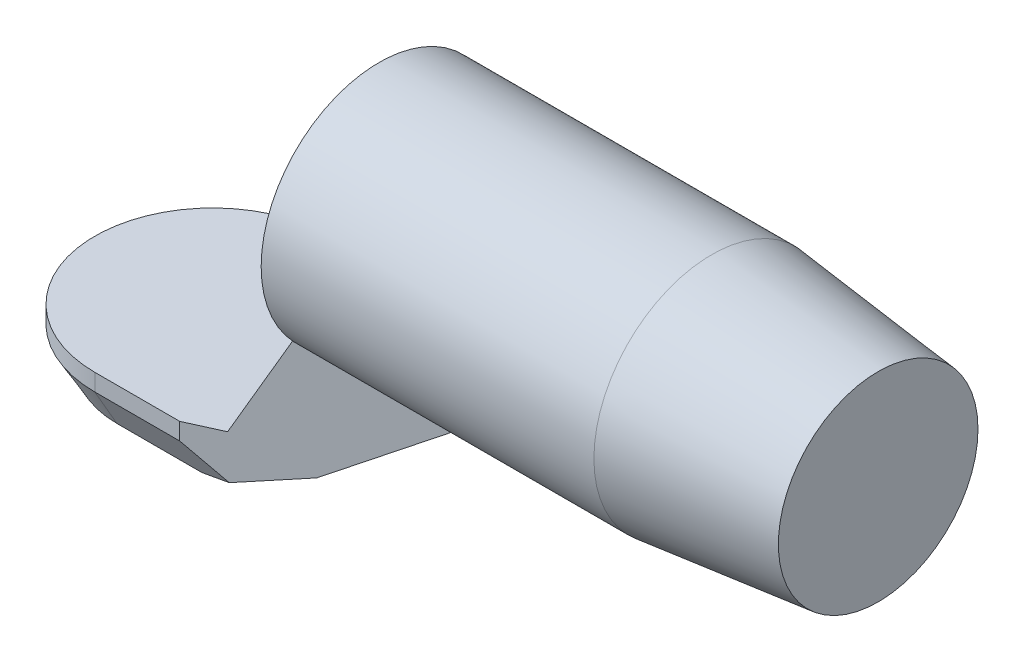
ISO-10303-21;
HEADER;
FILE_DESCRIPTION(('STEP AP214'),'2;1');
FILE_NAME('part.step','',(''),(''),'','','');
FILE_SCHEMA(('AUTOMOTIVE_DESIGN { 1 0 10303 214 1 1 1 1 }'));
ENDSEC;
DATA;
#1=APPLICATION_CONTEXT('core data for automotive mechanical design processes');
#2=APPLICATION_PROTOCOL_DEFINITION('international standard','automotive_design',2000,#1);
#3=PRODUCT_CONTEXT('',#1,'mechanical');
#4=PRODUCT('Part','Part','',(#3));
#5=PRODUCT_RELATED_PRODUCT_CATEGORY('part','',(#4));
#6=PRODUCT_DEFINITION_FORMATION('','',#4);
#7=PRODUCT_DEFINITION_CONTEXT('part definition',#1,'design');
#8=PRODUCT_DEFINITION('design','',#6,#7);
#9=PRODUCT_DEFINITION_SHAPE('','',#8);
#10=(LENGTH_UNIT() NAMED_UNIT(*) SI_UNIT(.MILLI.,.METRE.));
#11=(NAMED_UNIT(*) PLANE_ANGLE_UNIT() SI_UNIT($,.RADIAN.));
#12=(NAMED_UNIT(*) SI_UNIT($,.STERADIAN.) SOLID_ANGLE_UNIT());
#13=UNCERTAINTY_MEASURE_WITH_UNIT(LENGTH_MEASURE(1.E-05),#10,'distance_accuracy_value','');
#14=(GEOMETRIC_REPRESENTATION_CONTEXT(3) GLOBAL_UNCERTAINTY_ASSIGNED_CONTEXT((#13)) GLOBAL_UNIT_ASSIGNED_CONTEXT((#10,
#11,#12)) REPRESENTATION_CONTEXT('',''));
#15=CARTESIAN_POINT('',(0.,0.,0.));
#16=DIRECTION('',(0.,0.,1.));
#17=DIRECTION('',(1.,0.,0.));
#18=AXIS2_PLACEMENT_3D('',#15,#16,#17);
#19=CARTESIAN_POINT('',(0.,-40.,-27.));
#20=DIRECTION('',(0.,-1.,0.));
#21=DIRECTION('',(1.,0.,0.));
#22=AXIS2_PLACEMENT_3D('',#19,#20,#21);
#23=PLANE('',#22);
#24=CARTESIAN_POINT('',(-152.4,-40.,0.));
#25=DIRECTION('',(0.,1.,0.));
#26=DIRECTION('',(-1.,0.,0.));
#27=AXIS2_PLACEMENT_3D('',#24,#25,#26);
#28=CIRCLE('',#27,27.);
#29=CARTESIAN_POINT('',(-152.4,-40.,-27.));
#30=VERTEX_POINT('',#29);
#31=CARTESIAN_POINT('',(-152.4,-40.,27.));
#32=VERTEX_POINT('',#31);
#33=EDGE_CURVE('E143',#30,#32,#28,.T.);
#34=ORIENTED_EDGE('',*,*,#33,.T.);
#35=DIRECTION('',(1.,0.,0.));
#36=VECTOR('',#35,1.);
#37=CARTESIAN_POINT('',(0.,-40.,27.));
#38=LINE('',#37,#36);
#39=CARTESIAN_POINT('',(-132.943113445151,-40.,27.));
#40=VERTEX_POINT('',#39);
#41=EDGE_CURVE('E151',#32,#40,#38,.T.);
#42=ORIENTED_EDGE('',*,*,#41,.T.);
#43=DIRECTION('',(-0.910900783502955,0.,0.412625450758558));
#44=VECTOR('',#43,1.);
#45=CARTESIAN_POINT('',(-2.33837723127965,-40.,-32.162138322254));
#46=LINE('',#45,#44);
#47=CARTESIAN_POINT('',(-125.4,-40.,23.5830739836898));
#48=VERTEX_POINT('',#47);
#49=EDGE_CURVE('E223',#48,#40,#46,.T.);
#50=ORIENTED_EDGE('',*,*,#49,.F.);
#51=DIRECTION('',(0.,0.,1.));
#52=VECTOR('',#51,1.);
#53=CARTESIAN_POINT('',(-125.4,-40.,-27.));
#54=LINE('',#53,#52);
#55=CARTESIAN_POINT('',(-125.4,-40.,-23.5830739836898));
#56=VERTEX_POINT('',#55);
#57=EDGE_CURVE('E173',#56,#48,#54,.T.);
#58=ORIENTED_EDGE('',*,*,#57,.F.);
#59=DIRECTION('',(0.910900783502955,0.,0.412625450758558));
#60=VECTOR('',#59,1.);
#61=CARTESIAN_POINT('',(-22.6348629362981,-40.,22.9681111411141));
#62=LINE('',#61,#60);
#63=CARTESIAN_POINT('',(-132.943113445151,-40.,-27.));
#64=VERTEX_POINT('',#63);
#65=EDGE_CURVE('E234',#64,#56,#62,.T.);
#66=ORIENTED_EDGE('',*,*,#65,.F.);
#67=DIRECTION('',(1.,0.,0.));
#68=VECTOR('',#67,1.);
#69=CARTESIAN_POINT('',(0.,-40.,-27.));
#70=LINE('',#69,#68);
#71=EDGE_CURVE('E155',#30,#64,#70,.T.);
#72=ORIENTED_EDGE('',*,*,#71,.F.);
#73=EDGE_LOOP('',(#34,#42,#50,#58,#66,#72));
#74=FACE_BOUND('',#73,.T.);
#75=ADVANCED_FACE('F52',(#74),#23,.F.);
#76=CARTESIAN_POINT('',(0.,-52.7,-27.));
#77=DIRECTION('',(0.,1.,0.));
#78=DIRECTION('',(-1.,0.,0.));
#79=AXIS2_PLACEMENT_3D('',#76,#77,#78);
#80=PLANE('',#79);
#81=CARTESIAN_POINT('',(-152.4,-52.7,0.));
#82=DIRECTION('',(0.,1.,0.));
#83=DIRECTION('',(-1.,0.,0.));
#84=AXIS2_PLACEMENT_3D('',#81,#82,#83);
#85=CIRCLE('',#84,21.92);
#86=CARTESIAN_POINT('',(-152.4,-52.7,21.92));
#87=VERTEX_POINT('',#86);
#88=CARTESIAN_POINT('',(-152.4,-52.7,-21.92));
#89=VERTEX_POINT('',#88);
#90=EDGE_CURVE('E186',#87,#89,#85,.F.);
#91=ORIENTED_EDGE('',*,*,#90,.T.);
#92=DIRECTION('',(1.,0.,0.));
#93=VECTOR('',#92,1.);
#94=CARTESIAN_POINT('',(0.,-52.7,-21.92));
#95=LINE('',#94,#93);
#96=CARTESIAN_POINT('',(-132.943113445151,-52.7,-21.92));
#97=VERTEX_POINT('',#96);
#98=EDGE_CURVE('E190',#89,#97,#95,.T.);
#99=ORIENTED_EDGE('',*,*,#98,.T.);
#100=DIRECTION('',(0.,0.,1.));
#101=VECTOR('',#100,1.);
#102=CARTESIAN_POINT('',(-132.943113445151,-52.7,-27.));
#103=LINE('',#102,#101);
#104=CARTESIAN_POINT('',(-132.943113445151,-52.7,21.92));
#105=VERTEX_POINT('',#104);
#106=EDGE_CURVE('E170',#97,#105,#103,.T.);
#107=ORIENTED_EDGE('',*,*,#106,.T.);
#108=DIRECTION('',(-1.,0.,0.));
#109=VECTOR('',#108,1.);
#110=CARTESIAN_POINT('',(-152.4,-52.7,21.92));
#111=LINE('',#110,#109);
#112=EDGE_CURVE('E188',#105,#87,#111,.T.);
#113=ORIENTED_EDGE('',*,*,#112,.T.);
#114=EDGE_LOOP('',(#91,#99,#107,#113));
#115=FACE_BOUND('',#114,.T.);
#116=ADVANCED_FACE('F281',(#115),#80,.F.);
#117=CARTESIAN_POINT('',(-15.2923724101665,21.8653548185988,-27.));
#118=DIRECTION('',(-0.573125851127504,0.819467362845754,0.));
#119=DIRECTION('',(-0.819467362845754,-0.573125851127504,0.));
#120=AXIS2_PLACEMENT_3D('',#117,#118,#119);
#121=PLANE('',#120);
#122=DIRECTION('',(0.768244866604196,0.537301438727026,-0.348004294338689));
#123=VECTOR('',#122,1.);
#124=CARTESIAN_POINT('',(-15.1036637113754,21.9973354666556,-26.3796401805181));
#125=LINE('',#124,#123);
#126=CARTESIAN_POINT('',(-111.349334982476,-45.3157568730211,17.21831715033));
#127=VERTEX_POINT('',#126);
#128=CARTESIAN_POINT('',(-86.2505271874306,-27.7619454193626,5.84890451231851));
#129=VERTEX_POINT('',#128);
#130=EDGE_CURVE('E222',#127,#129,#125,.T.);
#131=ORIENTED_EDGE('',*,*,#130,.F.);
#132=DIRECTION('',(0.,0.,1.));
#133=VECTOR('',#132,1.);
#134=CARTESIAN_POINT('',(-111.349334982476,-45.3157568730211,-27.));
#135=LINE('',#134,#133);
#136=CARTESIAN_POINT('',(-111.349334982476,-45.3157568730211,-17.21831715033));
#137=VERTEX_POINT('',#136);
#138=EDGE_CURVE('E167',#137,#127,#135,.T.);
#139=ORIENTED_EDGE('',*,*,#138,.F.);
#140=DIRECTION('',(-0.768244866604196,-0.537301438727026,-0.348004294338689));
#141=VECTOR('',#140,1.);
#142=CARTESIAN_POINT('',(-29.5406993961987,11.9002422329622,19.839862781097));
#143=LINE('',#142,#141);
#144=CARTESIAN_POINT('',(-86.2505271874307,-27.7619454193626,-5.84890451231851));
#145=VERTEX_POINT('',#144);
#146=EDGE_CURVE('E163',#145,#137,#143,.T.);
#147=ORIENTED_EDGE('',*,*,#146,.F.);
#148=CARTESIAN_POINT('',(-88.9,-29.6149555935198,0.));
#149=DIRECTION('',(-0.573125851127504,0.819467362845754,0.));
#150=DIRECTION('',(-0.819467362845754,-0.573125851127504,0.));
#151=AXIS2_PLACEMENT_3D('',#148,#149,#150);
#152=ELLIPSE('',#151,7.83559163865379,6.42101161646386);
#153=EDGE_CURVE('E159',#129,#145,#152,.T.);
#154=ORIENTED_EDGE('',*,*,#153,.F.);
#155=EDGE_LOOP('',(#131,#139,#147,#154));
#156=FACE_BOUND('',#155,.T.);
#157=ADVANCED_FACE('F248',(#156),#121,.F.);
#158=CARTESIAN_POINT('',(2.21615707072963,-6.48071901221457,-27.));
#159=DIRECTION('',(0.323565987584047,-0.946205607507565,0.));
#160=DIRECTION('',(0.946205607507565,0.323565987584047,0.));
#161=AXIS2_PLACEMENT_3D('',#158,#159,#160);
#162=PLANE('',#161);
#163=ORIENTED_EDGE('',*,*,#106,.F.);
#164=DIRECTION('',(-0.930115062146568,-0.318063638877605,0.183634127525418));
#165=VECTOR('',#164,1.);
#166=CARTESIAN_POINT('',(-1.47394688663402,-7.74259288167652,-47.8761711018318));
#167=LINE('',#166,#165);
#168=CARTESIAN_POINT('',(-125.132748938957,-50.0291552229382,-23.4620129510003));
#169=VERTEX_POINT('',#168);
#170=EDGE_CURVE('E194',#97,#169,#167,.F.);
#171=ORIENTED_EDGE('',*,*,#170,.T.);
#172=DIRECTION('',(0.869685501181482,0.297399049260087,0.393955498164337));
#173=VECTOR('',#172,1.);
#174=CARTESIAN_POINT('',(-18.7606880242568,-13.6539946150043,24.7230587691653));
#175=LINE('',#174,#173);
#176=EDGE_CURVE('E236',#169,#137,#175,.T.);
#177=ORIENTED_EDGE('',*,*,#176,.T.);
#178=ORIENTED_EDGE('',*,*,#138,.T.);
#179=DIRECTION('',(-0.869685501181482,-0.297399049260087,0.393955498164337));
#180=VECTOR('',#179,1.);
#181=CARTESIAN_POINT('',(-0.259349241587179,-7.32724712234197,-33.1039092339965));
#182=LINE('',#181,#180);
#183=CARTESIAN_POINT('',(-125.132748938957,-50.0291552229382,23.4620129510003));
#184=VERTEX_POINT('',#183);
#185=EDGE_CURVE('E216',#127,#184,#182,.T.);
#186=ORIENTED_EDGE('',*,*,#185,.T.);
#187=DIRECTION('',(-0.930115062146568,-0.318063638877605,-0.183634127525418));
#188=VECTOR('',#187,1.);
#189=CARTESIAN_POINT('',(-10.6971937551529,-10.8965891781104,46.0552104910626));
#190=LINE('',#189,#188);
#191=EDGE_CURVE('E192',#184,#105,#190,.T.);
#192=ORIENTED_EDGE('',*,*,#191,.T.);
#193=EDGE_LOOP('',(#163,#171,#177,#178,#186,#192));
#194=FACE_BOUND('',#193,.T.);
#195=ADVANCED_FACE('F220',(#194),#162,.T.);
#196=CARTESIAN_POINT('',(-85.0294109128488,41.90870220159,-27.));
#197=DIRECTION('',(0.896969645389856,-0.44209213434441,0.));
#198=DIRECTION('',(0.44209213434441,0.896969645389856,0.));
#199=AXIS2_PLACEMENT_3D('',#196,#197,#198);
#200=PLANE('',#199);
#201=DIRECTION('',(-0.433485180824015,-0.879506823848088,0.196362788762585));
#202=VECTOR('',#201,1.);
#203=CARTESIAN_POINT('',(-82.2803845905745,47.4862571361837,4.05048485095459));
#204=LINE('',#203,#202);
#205=CARTESIAN_POINT('',(-101.191412815094,9.11729066348439,12.6169189640556));
#206=VERTEX_POINT('',#205);
#207=EDGE_CURVE('E227',#206,#48,#204,.T.);
#208=ORIENTED_EDGE('',*,*,#207,.F.);
#209=DIRECTION('',(0.,0.,1.));
#210=VECTOR('',#209,1.);
#211=CARTESIAN_POINT('',(-101.191412815094,9.11729066348439,-27.));
#212=LINE('',#211,#210);
#213=CARTESIAN_POINT('',(-101.191412815094,9.11729066348439,-12.6169189640556));
#214=VERTEX_POINT('',#213);
#215=EDGE_CURVE('E161',#214,#206,#212,.T.);
#216=ORIENTED_EDGE('',*,*,#215,.F.);
#217=DIRECTION('',(0.433485180824015,0.879506823848088,0.196362788762585));
#218=VECTOR('',#217,1.);
#219=CARTESIAN_POINT('',(-86.8768839762428,38.1603268521909,-6.13263547072805));
#220=LINE('',#219,#218);
#221=EDGE_CURVE('E232',#56,#214,#220,.T.);
#222=ORIENTED_EDGE('',*,*,#221,.F.);
#223=ORIENTED_EDGE('',*,*,#57,.T.);
#224=EDGE_LOOP('',(#208,#216,#222,#223));
#225=FACE_BOUND('',#224,.T.);
#226=ADVANCED_FACE('F265',(#225),#200,.F.);
#227=CARTESIAN_POINT('',(-47.3353532011235,-46.1372800578655,-27.));
#228=DIRECTION('',(-0.716111208331091,-0.697986201369758,0.));
#229=DIRECTION('',(0.697986201369758,-0.716111208331091,0.));
#230=AXIS2_PLACEMENT_3D('',#227,#228,#229);
#231=PLANE('',#230);
#232=DIRECTION('',(-0.66551323401047,0.682794996852812,0.301468286275181));
#233=VECTOR('',#232,1.);
#234=CARTESIAN_POINT('',(-44.281572957342,-49.270359560097,-13.1624510279191));
#235=LINE('',#234,#233);
#236=CARTESIAN_POINT('',(-86.2505271874306,-6.21157348793553,5.8489045123185));
#237=VERTEX_POINT('',#236);
#238=EDGE_CURVE('E256',#237,#206,#235,.T.);
#239=ORIENTED_EDGE('',*,*,#238,.F.);
#240=CARTESIAN_POINT('',(-88.9,-3.49330029925923,0.));
#241=DIRECTION('',(-0.716111208331091,-0.697986201369758,0.));
#242=DIRECTION('',(0.697986201369758,-0.716111208331091,0.));
#243=AXIS2_PLACEMENT_3D('',#240,#241,#242);
#244=ELLIPSE('',#243,9.19933890363877,6.42101161646386);
#245=CARTESIAN_POINT('',(-86.2505271874307,-6.21157348793544,-5.84890451231851));
#246=VERTEX_POINT('',#245);
#247=EDGE_CURVE('E181',#246,#237,#244,.T.);
#248=ORIENTED_EDGE('',*,*,#247,.F.);
#249=DIRECTION('',(0.66551323401047,-0.682794996852812,0.301468286275181));
#250=VECTOR('',#249,1.);
#251=CARTESIAN_POINT('',(-55.1156542014738,-38.1549435308588,8.25476213591554));
#252=LINE('',#251,#250);
#253=EDGE_CURVE('E225',#214,#246,#252,.T.);
#254=ORIENTED_EDGE('',*,*,#253,.F.);
#255=ORIENTED_EDGE('',*,*,#215,.T.);
#256=EDGE_LOOP('',(#239,#248,#254,#255));
#257=FACE_BOUND('',#256,.T.);
#258=ADVANCED_FACE('F268',(#257),#231,.F.);
#259=CARTESIAN_POINT('',(0.,0.,-27.));
#260=DIRECTION('',(0.,0.,1.));
#261=DIRECTION('',(1.,0.,0.));
#262=AXIS2_PLACEMENT_3D('',#259,#260,#261);
#263=PLANE('',#262);
#264=DIRECTION('',(0.,1.,0.));
#265=VECTOR('',#264,1.);
#266=CARTESIAN_POINT('',(-132.943113445151,0.,-27.));
#267=LINE('',#266,#265);
#268=CARTESIAN_POINT('',(-132.943113445151,-43.9011818975501,-27.));
#269=VERTEX_POINT('',#268);
#270=EDGE_CURVE('E179',#269,#64,#267,.T.);
#271=ORIENTED_EDGE('',*,*,#270,.F.);
#272=DIRECTION('',(-1.,0.,0.));
#273=VECTOR('',#272,1.);
#274=CARTESIAN_POINT('',(0.,-43.9011818975502,-27.));
#275=LINE('',#274,#273);
#276=CARTESIAN_POINT('',(-152.4,-43.9011818975501,-27.));
#277=VERTEX_POINT('',#276);
#278=EDGE_CURVE('E183',#269,#277,#275,.T.);
#279=ORIENTED_EDGE('',*,*,#278,.T.);
#280=DIRECTION('',(0.,1.,0.));
#281=VECTOR('',#280,1.);
#282=CARTESIAN_POINT('',(-152.4,-52.7,-27.));
#283=LINE('',#282,#281);
#284=EDGE_CURVE('E146',#277,#30,#283,.T.);
#285=ORIENTED_EDGE('',*,*,#284,.T.);
#286=ORIENTED_EDGE('',*,*,#71,.T.);
#287=EDGE_LOOP('',(#271,#279,#285,#286));
#288=FACE_BOUND('',#287,.T.);
#289=ADVANCED_FACE('F270',(#288),#263,.F.);
#290=CARTESIAN_POINT('',(0.,0.,27.));
#291=DIRECTION('',(0.,0.,1.));
#292=DIRECTION('',(1.,0.,0.));
#293=AXIS2_PLACEMENT_3D('',#290,#291,#292);
#294=PLANE('',#293);
#295=DIRECTION('',(0.,1.,0.));
#296=VECTOR('',#295,1.);
#297=CARTESIAN_POINT('',(-152.4,-52.7,27.));
#298=LINE('',#297,#296);
#299=CARTESIAN_POINT('',(-152.4,-43.9011818975501,27.));
#300=VERTEX_POINT('',#299);
#301=EDGE_CURVE('E140',#300,#32,#298,.T.);
#302=ORIENTED_EDGE('',*,*,#301,.F.);
#303=DIRECTION('',(1.,0.,0.));
#304=VECTOR('',#303,1.);
#305=CARTESIAN_POINT('',(-132.943113445151,-43.9011818975501,27.));
#306=LINE('',#305,#304);
#307=CARTESIAN_POINT('',(-132.943113445151,-43.9011818975501,27.));
#308=VERTEX_POINT('',#307);
#309=EDGE_CURVE('E69',#300,#308,#306,.T.);
#310=ORIENTED_EDGE('',*,*,#309,.T.);
#311=DIRECTION('',(0.,1.,0.));
#312=VECTOR('',#311,1.);
#313=CARTESIAN_POINT('',(-132.943113445151,0.,27.));
#314=LINE('',#313,#312);
#315=EDGE_CURVE('E158',#308,#40,#314,.T.);
#316=ORIENTED_EDGE('',*,*,#315,.T.);
#317=ORIENTED_EDGE('',*,*,#41,.F.);
#318=EDGE_LOOP('',(#302,#310,#316,#317));
#319=FACE_BOUND('',#318,.T.);
#320=ADVANCED_FACE('F157',(#319),#294,.T.);
#321=CARTESIAN_POINT('',(-88.9,27.0001,0.));
#322=DIRECTION('',(0.,-1.,0.));
#323=DIRECTION('',(1.,0.,0.));
#324=AXIS2_PLACEMENT_3D('',#321,#322,#323);
#325=CYLINDRICAL_SURFACE('',#324,6.42101161646386);
#326=ORIENTED_EDGE('',*,*,#153,.T.);
#327=DIRECTION('',(0.,-1.,0.));
#328=VECTOR('',#327,1.);
#329=CARTESIAN_POINT('',(-86.2505271874306,27.0001,-5.8489045123185));
#330=LINE('',#329,#328);
#331=EDGE_CURVE('E245',#246,#145,#330,.T.);
#332=ORIENTED_EDGE('',*,*,#331,.F.);
#333=ORIENTED_EDGE('',*,*,#247,.T.);
#334=DIRECTION('',(0.,-1.,0.));
#335=VECTOR('',#334,1.);
#336=CARTESIAN_POINT('',(-86.2505271874306,27.0001,5.84890451231851));
#337=LINE('',#336,#335);
#338=EDGE_CURVE('E251',#237,#129,#337,.T.);
#339=ORIENTED_EDGE('',*,*,#338,.T.);
#340=EDGE_LOOP('',(#326,#332,#333,#339));
#341=FACE_BOUND('',#340,.T.);
#342=ADVANCED_FACE('F254',(#341),#325,.T.);
#343=CARTESIAN_POINT('',(-86.2505271874306,27.0001,-5.8489045123185));
#344=DIRECTION('',(0.412625450758558,0.,-0.910900783502955));
#345=DIRECTION('',(-0.910900783502955,0.,-0.412625450758558));
#346=AXIS2_PLACEMENT_3D('',#343,#344,#345);
#347=PLANE('',#346);
#348=ORIENTED_EDGE('',*,*,#176,.F.);
#349=DIRECTION('',(0.741089336946627,-0.581455024914229,0.335703215155891));
#350=VECTOR('',#349,1.);
#351=CARTESIAN_POINT('',(-132.588900964885,-44.179095255995,-26.8395466476904));
#352=LINE('',#351,#350);
#353=EDGE_CURVE('E196',#169,#269,#352,.F.);
#354=ORIENTED_EDGE('',*,*,#353,.T.);
#355=ORIENTED_EDGE('',*,*,#270,.T.);
#356=ORIENTED_EDGE('',*,*,#65,.T.);
#357=ORIENTED_EDGE('',*,*,#221,.T.);
#358=ORIENTED_EDGE('',*,*,#253,.T.);
#359=ORIENTED_EDGE('',*,*,#331,.T.);
#360=ORIENTED_EDGE('',*,*,#146,.T.);
#361=EDGE_LOOP('',(#348,#354,#355,#356,#357,#358,#359,#360));
#362=FACE_BOUND('',#361,.T.);
#363=ADVANCED_FACE('F242',(#362),#347,.T.);
#364=CARTESIAN_POINT('',(-132.943113445151,27.0001,27.));
#365=DIRECTION('',(0.412625450758558,0.,0.910900783502955));
#366=DIRECTION('',(0.910900783502955,0.,-0.412625450758558));
#367=AXIS2_PLACEMENT_3D('',#364,#365,#366);
#368=PLANE('',#367);
#369=ORIENTED_EDGE('',*,*,#315,.F.);
#370=DIRECTION('',(0.741089336946627,-0.581455024914229,-0.335703215155892));
#371=VECTOR('',#370,1.);
#372=CARTESIAN_POINT('',(-163.495193256225,-19.930171329618,40.839669404143));
#373=LINE('',#372,#371);
#374=EDGE_CURVE('E61',#308,#184,#373,.T.);
#375=ORIENTED_EDGE('',*,*,#374,.T.);
#376=ORIENTED_EDGE('',*,*,#185,.F.);
#377=ORIENTED_EDGE('',*,*,#130,.T.);
#378=ORIENTED_EDGE('',*,*,#338,.F.);
#379=ORIENTED_EDGE('',*,*,#238,.T.);
#380=ORIENTED_EDGE('',*,*,#207,.T.);
#381=ORIENTED_EDGE('',*,*,#49,.T.);
#382=EDGE_LOOP('',(#369,#375,#376,#377,#378,#379,#380,#381));
#383=FACE_BOUND('',#382,.T.);
#384=ADVANCED_FACE('F215',(#383),#368,.T.);
#385=CARTESIAN_POINT('',(-152.4,-52.7,0.));
#386=DIRECTION('',(0.,1.,0.));
#387=DIRECTION('',(-1.,0.,0.));
#388=AXIS2_PLACEMENT_3D('',#385,#386,#387);
#389=CYLINDRICAL_SURFACE('',#388,27.);
#390=ORIENTED_EDGE('',*,*,#284,.F.);
#391=CARTESIAN_POINT('',(-152.4,-43.9011818975501,0.));
#392=DIRECTION('',(0.,1.,0.));
#393=DIRECTION('',(0.,0.,1.));
#394=AXIS2_PLACEMENT_3D('',#391,#392,#393);
#395=CIRCLE('',#394,27.);
#396=EDGE_CURVE('E13',#277,#300,#395,.T.);
#397=ORIENTED_EDGE('',*,*,#396,.T.);
#398=ORIENTED_EDGE('',*,*,#301,.T.);
#399=ORIENTED_EDGE('',*,*,#33,.F.);
#400=EDGE_LOOP('',(#390,#397,#398,#399));
#401=FACE_BOUND('',#400,.T.);
#402=ADVANCED_FACE('F142',(#401),#389,.T.);
#403=CARTESIAN_POINT('',(0.,-52.7,21.92));
#404=DIRECTION('',(0.,-0.500000000000001,0.866025403784438));
#405=DIRECTION('',(1.,0.,0.));
#406=AXIS2_PLACEMENT_3D('',#403,#404,#405);
#407=PLANE('',#406);
#408=ORIENTED_EDGE('',*,*,#374,.F.);
#409=ORIENTED_EDGE('',*,*,#309,.F.);
#410=DIRECTION('',(0.,0.866025403784438,0.500000000000001));
#411=VECTOR('',#410,1.);
#412=CARTESIAN_POINT('',(-152.4,-52.7,21.92));
#413=LINE('',#412,#411);
#414=EDGE_CURVE('E56',#87,#300,#413,.T.);
#415=ORIENTED_EDGE('',*,*,#414,.F.);
#416=ORIENTED_EDGE('',*,*,#112,.F.);
#417=ORIENTED_EDGE('',*,*,#191,.F.);
#418=EDGE_LOOP('',(#408,#409,#415,#416,#417));
#419=FACE_BOUND('',#418,.T.);
#420=ADVANCED_FACE('F54',(#419),#407,.T.);
#421=CARTESIAN_POINT('',(-152.4,-43.9011818975501,0.));
#422=DIRECTION('',(0.,1.,0.));
#423=DIRECTION('',(0.,0.,1.));
#424=AXIS2_PLACEMENT_3D('',#421,#422,#423);
#425=CONICAL_SURFACE('',#424,27.,0.5235987755983);
#426=ORIENTED_EDGE('',*,*,#414,.T.);
#427=ORIENTED_EDGE('',*,*,#396,.F.);
#428=DIRECTION('',(0.,0.866025403784438,-0.500000000000001));
#429=VECTOR('',#428,1.);
#430=CARTESIAN_POINT('',(-152.4,-52.7,-21.92));
#431=LINE('',#430,#429);
#432=EDGE_CURVE('E199',#89,#277,#431,.T.);
#433=ORIENTED_EDGE('',*,*,#432,.F.);
#434=ORIENTED_EDGE('',*,*,#90,.F.);
#435=EDGE_LOOP('',(#426,#427,#433,#434));
#436=FACE_BOUND('',#435,.T.);
#437=ADVANCED_FACE('F208',(#436),#425,.T.);
#438=CARTESIAN_POINT('',(0.,-43.9011818975502,-27.));
#439=DIRECTION('',(0.,0.500000000000001,0.866025403784438));
#440=DIRECTION('',(-1.,0.,0.));
#441=AXIS2_PLACEMENT_3D('',#438,#439,#440);
#442=PLANE('',#441);
#443=ORIENTED_EDGE('',*,*,#170,.F.);
#444=ORIENTED_EDGE('',*,*,#98,.F.);
#445=ORIENTED_EDGE('',*,*,#432,.T.);
#446=ORIENTED_EDGE('',*,*,#278,.F.);
#447=ORIENTED_EDGE('',*,*,#353,.F.);
#448=EDGE_LOOP('',(#443,#444,#445,#446,#447));
#449=FACE_BOUND('',#448,.T.);
#450=ADVANCED_FACE('F306',(#449),#442,.F.);
#451=CLOSED_SHELL('',(#75,#116,#157,#195,#226,#258,#289,#320,#342,#363,#384,#402,#420,#437,#450));
#452=MANIFOLD_SOLID_BREP('B2',#451);
#453=CARTESIAN_POINT('',(0.,0.,0.));
#454=DIRECTION('',(1.,0.,0.));
#455=DIRECTION('',(0.,0.,-1.));
#456=AXIS2_PLACEMENT_3D('',#453,#454,#455);
#457=PLANE('',#456);
#458=CARTESIAN_POINT('',(0.,0.,0.));
#459=DIRECTION('',(1.,0.,0.));
#460=DIRECTION('',(0.,0.,-1.));
#461=AXIS2_PLACEMENT_3D('',#458,#459,#460);
#462=CIRCLE('',#461,22.86);
#463=CARTESIAN_POINT('',(0.,0.,-22.86));
#464=VERTEX_POINT('',#463);
#465=EDGE_CURVE('E51',#464,#464,#462,.T.);
#466=ORIENTED_EDGE('',*,*,#465,.T.);
#467=EDGE_LOOP('',(#466));
#468=FACE_BOUND('',#467,.T.);
#469=ADVANCED_FACE('F403',(#468),#457,.T.);
#470=CARTESIAN_POINT('',(0.,0.,0.));
#471=DIRECTION('',(-1.,0.,0.));
#472=DIRECTION('',(0.,0.,1.));
#473=AXIS2_PLACEMENT_3D('',#470,#471,#472);
#474=CONICAL_SURFACE('',#473,22.86,0.108236755638002);
#475=CARTESIAN_POINT('',(-38.1,0.,0.));
#476=DIRECTION('',(-1.,0.,0.));
#477=DIRECTION('',(0.,0.,1.));
#478=AXIS2_PLACEMENT_3D('',#475,#476,#477);
#479=CIRCLE('',#478,27.);
#480=CARTESIAN_POINT('',(-38.1,0.,-27.));
#481=VERTEX_POINT('',#480);
#482=EDGE_CURVE('E417',#481,#481,#479,.T.);
#483=ORIENTED_EDGE('',*,*,#482,.F.);
#484=EDGE_LOOP('',(#483));
#485=FACE_BOUND('',#484,.T.);
#486=ORIENTED_EDGE('',*,*,#465,.F.);
#487=EDGE_LOOP('',(#486));
#488=FACE_BOUND('',#487,.T.);
#489=ADVANCED_FACE('F442',(#485,#488),#474,.T.);
#490=CARTESIAN_POINT('',(-114.3,0.,0.));
#491=DIRECTION('',(1.,0.,0.));
#492=DIRECTION('',(0.,0.,-1.));
#493=AXIS2_PLACEMENT_3D('',#490,#491,#492);
#494=CYLINDRICAL_SURFACE('',#493,27.);
#495=CARTESIAN_POINT('',(-114.3,0.,0.));
#496=DIRECTION('',(-1.,0.,0.));
#497=DIRECTION('',(0.,0.,1.));
#498=AXIS2_PLACEMENT_3D('',#495,#496,#497);
#499=CIRCLE('',#498,27.);
#500=CARTESIAN_POINT('',(-114.3,0.,-27.));
#501=VERTEX_POINT('',#500);
#502=EDGE_CURVE('E411',#501,#501,#499,.T.);
#503=CARTESIAN_POINT('',(-114.3,0.,-27.));
#504=CARTESIAN_POINT('',(-113.50625,0.,-27.));
#505=CARTESIAN_POINT('',(-112.7125,0.,-27.));
#506=CARTESIAN_POINT('',(-111.125,0.,-27.));
#507=CARTESIAN_POINT('',(-110.33125,0.,-27.));
#508=CARTESIAN_POINT('',(-108.74375,0.,-27.));
#509=CARTESIAN_POINT('',(-107.95,0.,-27.));
#510=CARTESIAN_POINT('',(-106.3625,0.,-27.));
#511=CARTESIAN_POINT('',(-105.56875,0.,-27.));
#512=CARTESIAN_POINT('',(-103.98125,0.,-27.));
#513=CARTESIAN_POINT('',(-103.1875,0.,-27.));
#514=CARTESIAN_POINT('',(-101.6,0.,-27.));
#515=CARTESIAN_POINT('',(-100.80625,0.,-27.));
#516=CARTESIAN_POINT('',(-99.21875,0.,-27.));
#517=CARTESIAN_POINT('',(-98.425,0.,-27.));
#518=CARTESIAN_POINT('',(-96.8375,0.,-27.));
#519=CARTESIAN_POINT('',(-96.04375,0.,-27.));
#520=CARTESIAN_POINT('',(-94.45625,0.,-27.));
#521=CARTESIAN_POINT('',(-93.6625,0.,-27.));
#522=CARTESIAN_POINT('',(-92.075,0.,-27.));
#523=CARTESIAN_POINT('',(-91.28125,0.,-27.));
#524=CARTESIAN_POINT('',(-89.69375,0.,-27.));
#525=CARTESIAN_POINT('',(-88.9,0.,-27.));
#526=CARTESIAN_POINT('',(-87.3125,0.,-27.));
#527=CARTESIAN_POINT('',(-86.51875,0.,-27.));
#528=CARTESIAN_POINT('',(-84.93125,0.,-27.));
#529=CARTESIAN_POINT('',(-84.1375,0.,-27.));
#530=CARTESIAN_POINT('',(-82.55,0.,-27.));
#531=CARTESIAN_POINT('',(-81.75625,0.,-27.));
#532=CARTESIAN_POINT('',(-80.16875,0.,-27.));
#533=CARTESIAN_POINT('',(-79.375,0.,-27.));
#534=CARTESIAN_POINT('',(-77.7875,0.,-27.));
#535=CARTESIAN_POINT('',(-76.99375,0.,-27.));
#536=CARTESIAN_POINT('',(-75.40625,0.,-27.));
#537=CARTESIAN_POINT('',(-74.6125,0.,-27.));
#538=CARTESIAN_POINT('',(-73.025,0.,-27.));
#539=CARTESIAN_POINT('',(-72.23125,0.,-27.));
#540=CARTESIAN_POINT('',(-70.64375,0.,-27.));
#541=CARTESIAN_POINT('',(-69.85,0.,-27.));
#542=CARTESIAN_POINT('',(-68.2625,0.,-27.));
#543=CARTESIAN_POINT('',(-67.46875,0.,-27.));
#544=CARTESIAN_POINT('',(-65.88125,0.,-27.));
#545=CARTESIAN_POINT('',(-65.0875,0.,-27.));
#546=CARTESIAN_POINT('',(-63.5,0.,-27.));
#547=CARTESIAN_POINT('',(-62.70625,0.,-27.));
#548=CARTESIAN_POINT('',(-61.11875,0.,-27.));
#549=CARTESIAN_POINT('',(-60.325,0.,-27.));
#550=CARTESIAN_POINT('',(-58.7375,0.,-27.));
#551=CARTESIAN_POINT('',(-57.94375,0.,-27.));
#552=CARTESIAN_POINT('',(-56.35625,0.,-27.));
#553=CARTESIAN_POINT('',(-55.5625,0.,-27.));
#554=CARTESIAN_POINT('',(-53.975,0.,-27.));
#555=CARTESIAN_POINT('',(-53.18125,0.,-27.));
#556=CARTESIAN_POINT('',(-51.59375,0.,-27.));
#557=CARTESIAN_POINT('',(-50.8,0.,-27.));
#558=CARTESIAN_POINT('',(-49.2125,0.,-27.));
#559=CARTESIAN_POINT('',(-48.41875,0.,-27.));
#560=CARTESIAN_POINT('',(-46.83125,0.,-27.));
#561=CARTESIAN_POINT('',(-46.0375,0.,-27.));
#562=CARTESIAN_POINT('',(-44.45,0.,-27.));
#563=CARTESIAN_POINT('',(-43.65625,0.,-27.));
#564=CARTESIAN_POINT('',(-42.06875,0.,-27.));
#565=CARTESIAN_POINT('',(-41.275,0.,-27.));
#566=CARTESIAN_POINT('',(-39.6875,0.,-27.));
#567=CARTESIAN_POINT('',(-38.89375,0.,-27.));
#568=CARTESIAN_POINT('',(-38.1,0.,-27.));
#569=B_SPLINE_CURVE_WITH_KNOTS('',3,(#503,#504,#505,#506,#507,#508,#509,#510,#511,#512,#513,
#514,#515,#516,#517,#518,#519,#520,#521,#522,#523,#524,#525,#526,#527,#528,#529,#530,#531,#532,
#533,#534,#535,#536,#537,#538,#539,#540,#541,#542,#543,#544,#545,#546,#547,#548,#549,#550,#551,
#552,#553,#554,#555,#556,#557,#558,#559,#560,#561,#562,#563,#564,#565,#566,#567,#568),
.UNSPECIFIED.,.F.,.F.,(4,2,2,2,2,2,2,2,2,2,2,2,2,2,2,2,2,2,2,2,2,2,2,2,2,2,2,2,2,2,2,2,4),(0.,
2.38124999999999,4.76249999999999,7.14374999999999,9.52499999999999,11.90625,14.2875,16.66875,
19.05,21.43125,23.8125,26.19375,28.575,30.95625,33.3375,35.71875,38.1,40.48125,42.8625,45.24375,
47.625,50.00625,52.3875,54.76875,57.15,59.53125,61.9125,64.29375,66.675,69.05625,71.4375,
73.81875,76.2),.UNSPECIFIED.);
#570=EDGE_CURVE('BSEAM432',#501,#481,#569,.T.);
#571=ORIENTED_EDGE('',*,*,#502,.F.);
#572=ORIENTED_EDGE('',*,*,#482,.T.);
#573=ORIENTED_EDGE('',*,*,#570,.T.);
#574=ORIENTED_EDGE('',*,*,#570,.F.);
#575=EDGE_LOOP('',(#571,#573,#572,#574));
#576=FACE_BOUND('',#575,.T.);
#577=ADVANCED_FACE('F432',(#576),#494,.T.);
#578=CARTESIAN_POINT('',(-114.3,0.,0.));
#579=DIRECTION('',(-1.,0.,0.));
#580=DIRECTION('',(0.,0.,1.));
#581=AXIS2_PLACEMENT_3D('',#578,#579,#580);
#582=PLANE('',#581);
#583=ORIENTED_EDGE('',*,*,#502,.T.);
#584=EDGE_LOOP('',(#583));
#585=FACE_BOUND('',#584,.T.);
#586=ADVANCED_FACE('F441',(#585),#582,.T.);
#587=CLOSED_SHELL('',(#469,#489,#577,#586));
#588=MANIFOLD_SOLID_BREP('B7',#587);
#589=ADVANCED_BREP_SHAPE_REPRESENTATION('',(#18,#452,#588),#14);
#590=SHAPE_DEFINITION_REPRESENTATION(#9,#589);
ENDSEC;
END-ISO-10303-21;
